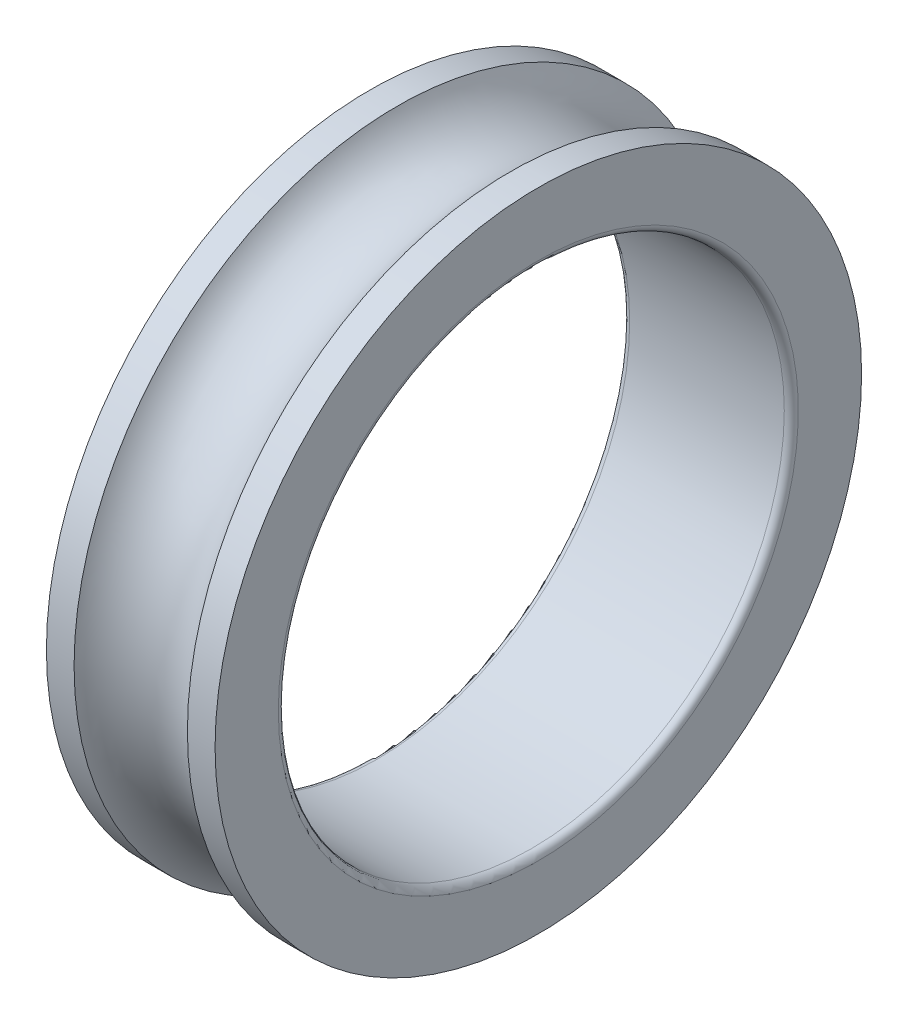
ISO-10303-21;
HEADER;
FILE_DESCRIPTION(('STEP AP214'),'2;1');
FILE_NAME('part.step','',(''),(''),'','','');
FILE_SCHEMA(('AUTOMOTIVE_DESIGN { 1 0 10303 214 1 1 1 1 }'));
ENDSEC;
DATA;
#1=APPLICATION_CONTEXT('core data for automotive mechanical design processes');
#2=APPLICATION_PROTOCOL_DEFINITION('international standard','automotive_design',2000,#1);
#3=PRODUCT_CONTEXT('',#1,'mechanical');
#4=PRODUCT('Part','Part','',(#3));
#5=PRODUCT_RELATED_PRODUCT_CATEGORY('part','',(#4));
#6=PRODUCT_DEFINITION_FORMATION('','',#4);
#7=PRODUCT_DEFINITION_CONTEXT('part definition',#1,'design');
#8=PRODUCT_DEFINITION('design','',#6,#7);
#9=PRODUCT_DEFINITION_SHAPE('','',#8);
#10=(LENGTH_UNIT() NAMED_UNIT(*) SI_UNIT(.MILLI.,.METRE.));
#11=(NAMED_UNIT(*) PLANE_ANGLE_UNIT() SI_UNIT($,.RADIAN.));
#12=(NAMED_UNIT(*) SI_UNIT($,.STERADIAN.) SOLID_ANGLE_UNIT());
#13=UNCERTAINTY_MEASURE_WITH_UNIT(LENGTH_MEASURE(1.E-05),#10,'distance_accuracy_value','');
#14=(GEOMETRIC_REPRESENTATION_CONTEXT(3) GLOBAL_UNCERTAINTY_ASSIGNED_CONTEXT((#13)) GLOBAL_UNIT_ASSIGNED_CONTEXT((#10,
#11,#12)) REPRESENTATION_CONTEXT('',''));
#15=CARTESIAN_POINT('',(0.,0.,0.));
#16=DIRECTION('',(0.,0.,1.));
#17=DIRECTION('',(1.,0.,0.));
#18=AXIS2_PLACEMENT_3D('',#15,#16,#17);
#19=CARTESIAN_POINT('',(-16.6666666666667,63.8888888888889,0.));
#20=DIRECTION('',(1.,0.,0.));
#21=DIRECTION('',(0.,0.,-1.));
#22=AXIS2_PLACEMENT_3D('',#19,#20,#21);
#23=PLANE('',#22);
#24=CARTESIAN_POINT('',(-16.6666666666667,0.,0.));
#25=DIRECTION('',(1.,0.,0.));
#26=DIRECTION('',(0.,0.,-1.));
#27=AXIS2_PLACEMENT_3D('',#24,#25,#26);
#28=CIRCLE('',#27,51.3888888888889);
#29=CARTESIAN_POINT('',(-16.6666666666667,0.,-51.3888888888889));
#30=VERTEX_POINT('',#29);
#31=EDGE_CURVE('E51',#30,#30,#28,.T.);
#32=ORIENTED_EDGE('',*,*,#31,.T.);
#33=EDGE_LOOP('',(#32));
#34=FACE_BOUND('',#33,.T.);
#35=CARTESIAN_POINT('',(-16.6666666666667,0.,0.));
#36=DIRECTION('',(-1.,0.,0.));
#37=DIRECTION('',(0.,0.,1.));
#38=AXIS2_PLACEMENT_3D('',#35,#36,#37);
#39=CIRCLE('',#38,63.8888888888889);
#40=CARTESIAN_POINT('',(-16.6666666666667,0.,63.8888888888889));
#41=VERTEX_POINT('',#40);
#42=EDGE_CURVE('E79',#41,#41,#39,.T.);
#43=ORIENTED_EDGE('',*,*,#42,.T.);
#44=EDGE_LOOP('',(#43));
#45=FACE_BOUND('',#44,.T.);
#46=ADVANCED_FACE('F43',(#34,#45),#23,.F.);
#47=CARTESIAN_POINT('',(-18.306476766056,0.,0.));
#48=DIRECTION('',(-1.,0.,0.));
#49=DIRECTION('',(0.,0.,1.));
#50=AXIS2_PLACEMENT_3D('',#47,#48,#49);
#51=CYLINDRICAL_SURFACE('',#50,50.);
#52=CARTESIAN_POINT('',(-15.2777777777778,0.,0.));
#53=DIRECTION('',(1.,0.,0.));
#54=DIRECTION('',(0.,0.,-1.));
#55=AXIS2_PLACEMENT_3D('',#52,#53,#54);
#56=CIRCLE('',#55,50.);
#57=CARTESIAN_POINT('',(-15.2777777777778,0.,-50.));
#58=VERTEX_POINT('',#57);
#59=EDGE_CURVE('E56',#58,#58,#56,.F.);
#60=ORIENTED_EDGE('',*,*,#59,.T.);
#61=EDGE_LOOP('',(#60));
#62=FACE_BOUND('',#61,.T.);
#63=CARTESIAN_POINT('',(15.2777777777778,0.,0.));
#64=DIRECTION('',(-1.,0.,0.));
#65=DIRECTION('',(0.,0.,1.));
#66=AXIS2_PLACEMENT_3D('',#63,#64,#65);
#67=CIRCLE('',#66,50.);
#68=CARTESIAN_POINT('',(15.2777777777778,0.,50.));
#69=VERTEX_POINT('',#68);
#70=EDGE_CURVE('E61',#69,#69,#67,.F.);
#71=ORIENTED_EDGE('',*,*,#70,.T.);
#72=EDGE_LOOP('',(#71));
#73=FACE_BOUND('',#72,.T.);
#74=ADVANCED_FACE('F106',(#62,#73),#51,.F.);
#75=CARTESIAN_POINT('',(16.6666666666667,63.8888888888889,0.));
#76=DIRECTION('',(-1.,0.,0.));
#77=DIRECTION('',(0.,0.,1.));
#78=AXIS2_PLACEMENT_3D('',#75,#76,#77);
#79=PLANE('',#78);
#80=CARTESIAN_POINT('',(16.6666666666667,0.,0.));
#81=DIRECTION('',(-1.,0.,0.));
#82=DIRECTION('',(0.,0.,1.));
#83=AXIS2_PLACEMENT_3D('',#80,#81,#82);
#84=CIRCLE('',#83,51.3888888888889);
#85=CARTESIAN_POINT('',(16.6666666666667,0.,51.3888888888889));
#86=VERTEX_POINT('',#85);
#87=EDGE_CURVE('E10',#86,#86,#84,.T.);
#88=ORIENTED_EDGE('',*,*,#87,.T.);
#89=EDGE_LOOP('',(#88));
#90=FACE_BOUND('',#89,.T.);
#91=CARTESIAN_POINT('',(16.6666666666667,0.,0.));
#92=DIRECTION('',(-1.,0.,0.));
#93=DIRECTION('',(0.,0.,1.));
#94=AXIS2_PLACEMENT_3D('',#91,#92,#93);
#95=CIRCLE('',#94,63.8888888888889);
#96=CARTESIAN_POINT('',(16.6666666666667,0.,63.8888888888889));
#97=VERTEX_POINT('',#96);
#98=EDGE_CURVE('E67',#97,#97,#95,.T.);
#99=ORIENTED_EDGE('',*,*,#98,.F.);
#100=EDGE_LOOP('',(#99));
#101=FACE_BOUND('',#100,.T.);
#102=ADVANCED_FACE('F101',(#90,#101),#79,.F.);
#103=CARTESIAN_POINT('',(-18.306476766056,0.,0.));
#104=DIRECTION('',(-1.,0.,0.));
#105=DIRECTION('',(0.,0.,1.));
#106=AXIS2_PLACEMENT_3D('',#103,#104,#105);
#107=CYLINDRICAL_SURFACE('',#106,63.8888888888889);
#108=CARTESIAN_POINT('',(11.1975802059702,0.,0.));
#109=DIRECTION('',(-1.,0.,0.));
#110=DIRECTION('',(0.,0.,1.));
#111=AXIS2_PLACEMENT_3D('',#108,#109,#110);
#112=CIRCLE('',#111,63.8888888888889);
#113=CARTESIAN_POINT('',(11.1975802059702,0.,63.8888888888889));
#114=VERTEX_POINT('',#113);
#115=EDGE_CURVE('E71',#114,#114,#112,.T.);
#116=ORIENTED_EDGE('',*,*,#115,.F.);
#117=EDGE_LOOP('',(#116));
#118=FACE_BOUND('',#117,.T.);
#119=ORIENTED_EDGE('',*,*,#98,.T.);
#120=EDGE_LOOP('',(#119));
#121=FACE_BOUND('',#120,.T.);
#122=ADVANCED_FACE('F95',(#118,#121),#107,.T.);
#123=CARTESIAN_POINT('',(0.,0.,0.));
#124=DIRECTION('',(-1.,0.,0.));
#125=DIRECTION('',(0.,0.,1.));
#126=AXIS2_PLACEMENT_3D('',#123,#124,#125);
#127=TOROIDAL_SURFACE('',#126,69.4444444444444,12.5);
#128=CARTESIAN_POINT('',(-11.1975802059702,0.,0.));
#129=DIRECTION('',(-1.,0.,0.));
#130=DIRECTION('',(0.,0.,1.));
#131=AXIS2_PLACEMENT_3D('',#128,#129,#130);
#132=CIRCLE('',#131,63.8888888888889);
#133=CARTESIAN_POINT('',(-11.1975802059702,0.,63.8888888888889));
#134=VERTEX_POINT('',#133);
#135=EDGE_CURVE('E75',#134,#134,#132,.T.);
#136=ORIENTED_EDGE('',*,*,#135,.F.);
#137=EDGE_LOOP('',(#136));
#138=FACE_BOUND('',#137,.T.);
#139=ORIENTED_EDGE('',*,*,#115,.T.);
#140=EDGE_LOOP('',(#139));
#141=FACE_BOUND('',#140,.T.);
#142=ADVANCED_FACE('F89',(#138,#141),#127,.F.);
#143=CARTESIAN_POINT('',(-18.306476766056,0.,0.));
#144=DIRECTION('',(-1.,0.,0.));
#145=DIRECTION('',(0.,0.,1.));
#146=AXIS2_PLACEMENT_3D('',#143,#144,#145);
#147=CYLINDRICAL_SURFACE('',#146,63.8888888888889);
#148=ORIENTED_EDGE('',*,*,#42,.F.);
#149=EDGE_LOOP('',(#148));
#150=FACE_BOUND('',#149,.T.);
#151=ORIENTED_EDGE('',*,*,#135,.T.);
#152=EDGE_LOOP('',(#151));
#153=FACE_BOUND('',#152,.T.);
#154=ADVANCED_FACE('F85',(#150,#153),#147,.T.);
#155=CARTESIAN_POINT('',(-15.2777777777778,0.,0.));
#156=DIRECTION('',(1.,0.,0.));
#157=DIRECTION('',(0.,0.,-1.));
#158=AXIS2_PLACEMENT_3D('',#155,#156,#157);
#159=TOROIDAL_SURFACE('',#158,51.3888888888889,1.38888888888889);
#160=ORIENTED_EDGE('',*,*,#31,.F.);
#161=EDGE_LOOP('',(#160));
#162=FACE_BOUND('',#161,.T.);
#163=ORIENTED_EDGE('',*,*,#59,.F.);
#164=EDGE_LOOP('',(#163));
#165=FACE_BOUND('',#164,.T.);
#166=ADVANCED_FACE('F88',(#162,#165),#159,.T.);
#167=CARTESIAN_POINT('',(15.2777777777778,0.,0.));
#168=DIRECTION('',(-1.,0.,0.));
#169=DIRECTION('',(0.,0.,1.));
#170=AXIS2_PLACEMENT_3D('',#167,#168,#169);
#171=TOROIDAL_SURFACE('',#170,51.3888888888889,1.38888888888889);
#172=ORIENTED_EDGE('',*,*,#70,.F.);
#173=EDGE_LOOP('',(#172));
#174=FACE_BOUND('',#173,.T.);
#175=ORIENTED_EDGE('',*,*,#87,.F.);
#176=EDGE_LOOP('',(#175));
#177=FACE_BOUND('',#176,.T.);
#178=ADVANCED_FACE('F45',(#174,#177),#171,.T.);
#179=CLOSED_SHELL('',(#46,#74,#102,#122,#142,#154,#166,#178));
#180=MANIFOLD_SOLID_BREP('B2',#179);
#181=ADVANCED_BREP_SHAPE_REPRESENTATION('',(#18,#180),#14);
#182=SHAPE_DEFINITION_REPRESENTATION(#9,#181);
ENDSEC;
END-ISO-10303-21;
